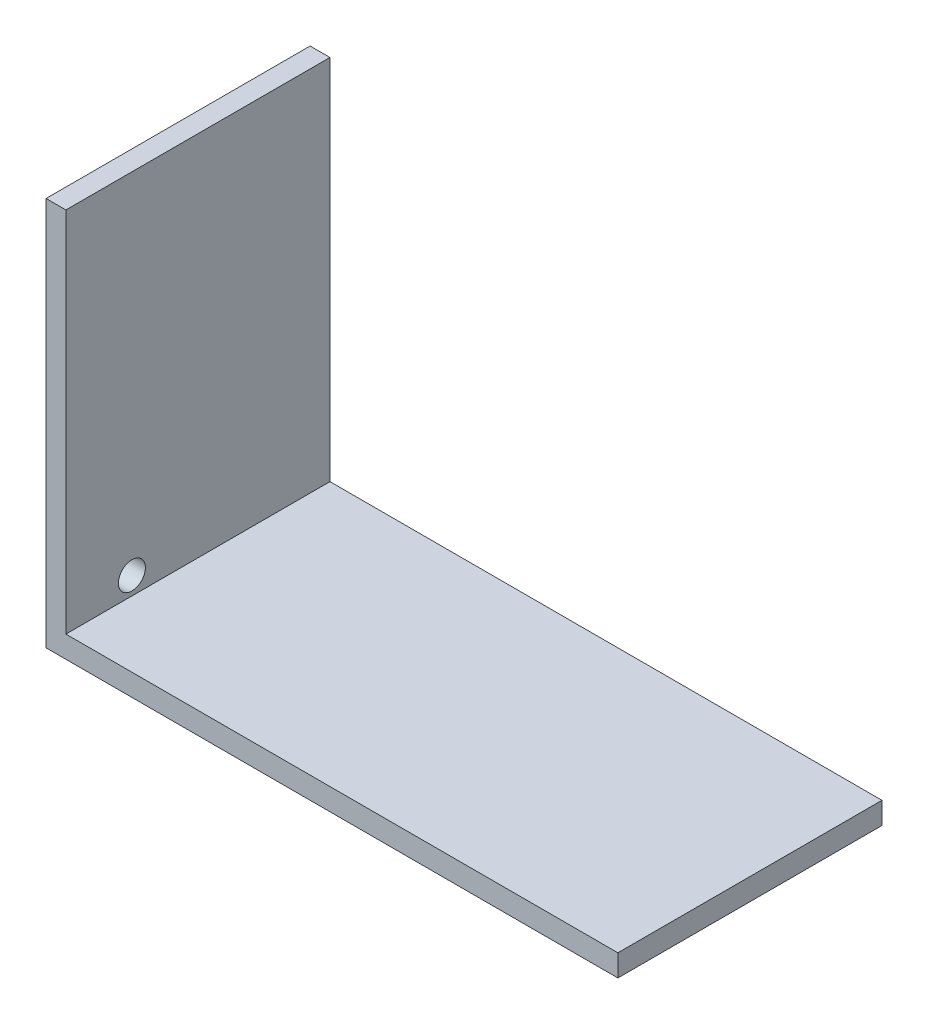
ISO-10303-21;
HEADER;
FILE_DESCRIPTION(('STEP AP214'),'2;1');
FILE_NAME('part.step','',(''),(''),'','','');
FILE_SCHEMA(('AUTOMOTIVE_DESIGN { 1 0 10303 214 1 1 1 1 }'));
ENDSEC;
DATA;
#1=APPLICATION_CONTEXT('core data for automotive mechanical design processes');
#2=APPLICATION_PROTOCOL_DEFINITION('international standard','automotive_design',2000,#1);
#3=PRODUCT_CONTEXT('',#1,'mechanical');
#4=PRODUCT('Part','Part','',(#3));
#5=PRODUCT_RELATED_PRODUCT_CATEGORY('part','',(#4));
#6=PRODUCT_DEFINITION_FORMATION('','',#4);
#7=PRODUCT_DEFINITION_CONTEXT('part definition',#1,'design');
#8=PRODUCT_DEFINITION('design','',#6,#7);
#9=PRODUCT_DEFINITION_SHAPE('','',#8);
#10=(LENGTH_UNIT() NAMED_UNIT(*) SI_UNIT(.MILLI.,.METRE.));
#11=(NAMED_UNIT(*) PLANE_ANGLE_UNIT() SI_UNIT($,.RADIAN.));
#12=(NAMED_UNIT(*) SI_UNIT($,.STERADIAN.) SOLID_ANGLE_UNIT());
#13=UNCERTAINTY_MEASURE_WITH_UNIT(LENGTH_MEASURE(1.E-05),#10,'distance_accuracy_value','');
#14=(GEOMETRIC_REPRESENTATION_CONTEXT(3) GLOBAL_UNCERTAINTY_ASSIGNED_CONTEXT((#13)) GLOBAL_UNIT_ASSIGNED_CONTEXT((#10,
#11,#12)) REPRESENTATION_CONTEXT('',''));
#15=CARTESIAN_POINT('',(0.,0.,0.));
#16=DIRECTION('',(0.,0.,1.));
#17=DIRECTION('',(1.,0.,0.));
#18=AXIS2_PLACEMENT_3D('',#15,#16,#17);
#19=CARTESIAN_POINT('',(-3.67500000001195,2.75,2.5));
#20=DIRECTION('',(0.,0.,-1.));
#21=DIRECTION('',(-1.,0.,0.));
#22=AXIS2_PLACEMENT_3D('',#19,#20,#21);
#23=PLANE('',#22);
#24=DIRECTION('',(1.,0.,0.));
#25=VECTOR('',#24,1.);
#26=CARTESIAN_POINT('',(-3.67500000001195,0.,2.5));
#27=LINE('',#26,#25);
#28=CARTESIAN_POINT('',(-6.17500000001195,0.,2.5));
#29=VERTEX_POINT('',#28);
#30=CARTESIAN_POINT('',(65.8249999999881,0.,2.5));
#31=VERTEX_POINT('',#30);
#32=EDGE_CURVE('E67',#29,#31,#27,.T.);
#33=ORIENTED_EDGE('',*,*,#32,.T.);
#34=DIRECTION('',(0.,-1.,0.));
#35=VECTOR('',#34,1.);
#36=CARTESIAN_POINT('',(65.8249999999881,2.75,2.5));
#37=LINE('',#36,#35);
#38=CARTESIAN_POINT('',(65.8249999999881,2.75,2.5));
#39=VERTEX_POINT('',#38);
#40=EDGE_CURVE('E11',#39,#31,#37,.T.);
#41=ORIENTED_EDGE('',*,*,#40,.F.);
#42=DIRECTION('',(1.,0.,0.));
#43=VECTOR('',#42,1.);
#44=CARTESIAN_POINT('',(-3.67500000001195,2.75,2.5));
#45=LINE('',#44,#43);
#46=CARTESIAN_POINT('',(-3.67500000001195,2.75,2.5));
#47=VERTEX_POINT('',#46);
#48=EDGE_CURVE('E96',#47,#39,#45,.T.);
#49=ORIENTED_EDGE('',*,*,#48,.F.);
#50=DIRECTION('',(0.,1.,0.));
#51=VECTOR('',#50,1.);
#52=CARTESIAN_POINT('',(-3.67500000001195,0.,2.5));
#53=LINE('',#52,#51);
#54=CARTESIAN_POINT('',(-3.67500000001195,49.,2.5));
#55=VERTEX_POINT('',#54);
#56=EDGE_CURVE('E86',#47,#55,#53,.T.);
#57=ORIENTED_EDGE('',*,*,#56,.T.);
#58=DIRECTION('',(1.,0.,0.));
#59=VECTOR('',#58,1.);
#60=CARTESIAN_POINT('',(-6.17500000001195,49.,2.5));
#61=LINE('',#60,#59);
#62=CARTESIAN_POINT('',(-6.17500000001195,49.,2.5));
#63=VERTEX_POINT('',#62);
#64=EDGE_CURVE('E107',#63,#55,#61,.T.);
#65=ORIENTED_EDGE('',*,*,#64,.F.);
#66=DIRECTION('',(0.,1.,0.));
#67=VECTOR('',#66,1.);
#68=CARTESIAN_POINT('',(-6.17500000001195,0.,2.5));
#69=LINE('',#68,#67);
#70=EDGE_CURVE('E131',#29,#63,#69,.T.);
#71=ORIENTED_EDGE('',*,*,#70,.F.);
#72=EDGE_LOOP('',(#33,#41,#49,#57,#65,#71));
#73=FACE_BOUND('',#72,.T.);
#74=ADVANCED_FACE('F39',(#73),#23,.F.);
#75=CARTESIAN_POINT('',(65.8249999999881,2.75,2.5));
#76=DIRECTION('',(-1.,0.,0.));
#77=DIRECTION('',(0.,0.,1.));
#78=AXIS2_PLACEMENT_3D('',#75,#76,#77);
#79=PLANE('',#78);
#80=DIRECTION('',(0.,0.,-1.));
#81=VECTOR('',#80,1.);
#82=CARTESIAN_POINT('',(65.8249999999881,0.,2.5));
#83=LINE('',#82,#81);
#84=CARTESIAN_POINT('',(65.8249999999881,0.,-30.75));
#85=VERTEX_POINT('',#84);
#86=EDGE_CURVE('E104',#31,#85,#83,.T.);
#87=ORIENTED_EDGE('',*,*,#86,.T.);
#88=DIRECTION('',(0.,-1.,0.));
#89=VECTOR('',#88,1.);
#90=CARTESIAN_POINT('',(65.8249999999881,2.75,-30.75));
#91=LINE('',#90,#89);
#92=CARTESIAN_POINT('',(65.8249999999881,2.75,-30.75));
#93=VERTEX_POINT('',#92);
#94=EDGE_CURVE('E47',#93,#85,#91,.T.);
#95=ORIENTED_EDGE('',*,*,#94,.F.);
#96=DIRECTION('',(0.,0.,-1.));
#97=VECTOR('',#96,1.);
#98=CARTESIAN_POINT('',(65.8249999999881,2.75,2.5));
#99=LINE('',#98,#97);
#100=EDGE_CURVE('E55',#39,#93,#99,.T.);
#101=ORIENTED_EDGE('',*,*,#100,.F.);
#102=ORIENTED_EDGE('',*,*,#40,.T.);
#103=EDGE_LOOP('',(#87,#95,#101,#102));
#104=FACE_BOUND('',#103,.T.);
#105=ADVANCED_FACE('F166',(#104),#79,.F.);
#106=CARTESIAN_POINT('',(-3.67500000001195,2.75,-30.75));
#107=DIRECTION('',(0.,0.,1.));
#108=DIRECTION('',(1.,0.,0.));
#109=AXIS2_PLACEMENT_3D('',#106,#107,#108);
#110=PLANE('',#109);
#111=DIRECTION('',(-1.,0.,0.));
#112=VECTOR('',#111,1.);
#113=CARTESIAN_POINT('',(-3.67500000001195,0.,-30.75));
#114=LINE('',#113,#112);
#115=CARTESIAN_POINT('',(-6.17500000001195,0.,-30.75));
#116=VERTEX_POINT('',#115);
#117=EDGE_CURVE('E101',#85,#116,#114,.T.);
#118=ORIENTED_EDGE('',*,*,#117,.T.);
#119=DIRECTION('',(0.,-1.,0.));
#120=VECTOR('',#119,1.);
#121=CARTESIAN_POINT('',(-6.17500000001195,0.,-30.75));
#122=LINE('',#121,#120);
#123=CARTESIAN_POINT('',(-6.17500000001195,49.,-30.75));
#124=VERTEX_POINT('',#123);
#125=EDGE_CURVE('E132',#124,#116,#122,.T.);
#126=ORIENTED_EDGE('',*,*,#125,.F.);
#127=DIRECTION('',(1.,0.,0.));
#128=VECTOR('',#127,1.);
#129=CARTESIAN_POINT('',(-6.17500000001195,49.,-30.75));
#130=LINE('',#129,#128);
#131=CARTESIAN_POINT('',(-3.67500000001195,49.,-30.75));
#132=VERTEX_POINT('',#131);
#133=EDGE_CURVE('E147',#124,#132,#130,.T.);
#134=ORIENTED_EDGE('',*,*,#133,.T.);
#135=DIRECTION('',(0.,-1.,0.));
#136=VECTOR('',#135,1.);
#137=CARTESIAN_POINT('',(-3.67500000001195,0.,-30.75));
#138=LINE('',#137,#136);
#139=CARTESIAN_POINT('',(-3.67500000001195,2.75,-30.75));
#140=VERTEX_POINT('',#139);
#141=EDGE_CURVE('E94',#132,#140,#138,.T.);
#142=ORIENTED_EDGE('',*,*,#141,.T.);
#143=DIRECTION('',(-1.,0.,0.));
#144=VECTOR('',#143,1.);
#145=CARTESIAN_POINT('',(-3.67500000001195,2.75,-30.75));
#146=LINE('',#145,#144);
#147=EDGE_CURVE('E100',#93,#140,#146,.T.);
#148=ORIENTED_EDGE('',*,*,#147,.F.);
#149=ORIENTED_EDGE('',*,*,#94,.T.);
#150=EDGE_LOOP('',(#118,#126,#134,#142,#148,#149));
#151=FACE_BOUND('',#150,.T.);
#152=ADVANCED_FACE('F116',(#151),#110,.F.);
#153=CARTESIAN_POINT('',(0.,2.75,0.));
#154=DIRECTION('',(0.,-1.,0.));
#155=DIRECTION('',(0.,0.,-1.));
#156=AXIS2_PLACEMENT_3D('',#153,#154,#155);
#157=PLANE('',#156);
#158=DIRECTION('',(0.,0.,1.));
#159=VECTOR('',#158,1.);
#160=CARTESIAN_POINT('',(-3.67500000001195,2.75,2.5));
#161=LINE('',#160,#159);
#162=EDGE_CURVE('E76',#140,#47,#161,.T.);
#163=ORIENTED_EDGE('',*,*,#162,.T.);
#164=ORIENTED_EDGE('',*,*,#48,.T.);
#165=ORIENTED_EDGE('',*,*,#100,.T.);
#166=ORIENTED_EDGE('',*,*,#147,.T.);
#167=EDGE_LOOP('',(#163,#164,#165,#166));
#168=FACE_BOUND('',#167,.T.);
#169=ADVANCED_FACE('F98',(#168),#157,.F.);
#170=CARTESIAN_POINT('',(0.,0.,0.));
#171=DIRECTION('',(0.,-1.,0.));
#172=DIRECTION('',(0.,0.,-1.));
#173=AXIS2_PLACEMENT_3D('',#170,#171,#172);
#174=PLANE('',#173);
#175=ORIENTED_EDGE('',*,*,#32,.F.);
#176=DIRECTION('',(0.,0.,1.));
#177=VECTOR('',#176,1.);
#178=CARTESIAN_POINT('',(-6.17500000001195,0.,-30.75));
#179=LINE('',#178,#177);
#180=EDGE_CURVE('E125',#116,#29,#179,.T.);
#181=ORIENTED_EDGE('',*,*,#180,.F.);
#182=ORIENTED_EDGE('',*,*,#117,.F.);
#183=ORIENTED_EDGE('',*,*,#86,.F.);
#184=EDGE_LOOP('',(#175,#181,#182,#183));
#185=FACE_BOUND('',#184,.T.);
#186=ADVANCED_FACE('F123',(#185),#174,.T.);
#187=CARTESIAN_POINT('',(-3.67500000001195,0.,0.));
#188=DIRECTION('',(1.,0.,0.));
#189=DIRECTION('',(0.,0.,-1.));
#190=AXIS2_PLACEMENT_3D('',#187,#188,#189);
#191=PLANE('',#190);
#192=CARTESIAN_POINT('',(-3.67500000001195,5.00000000000001,-5.8125));
#193=DIRECTION('',(1.,0.,0.));
#194=DIRECTION('',(0.,0.,-1.));
#195=AXIS2_PLACEMENT_3D('',#192,#193,#194);
#196=CIRCLE('',#195,1.69999999999999);
#197=CARTESIAN_POINT('',(-3.67500000001195,5.00000000000001,-7.51249999999999));
#198=VERTEX_POINT('',#197);
#199=EDGE_CURVE('E142',#198,#198,#196,.T.);
#200=ORIENTED_EDGE('',*,*,#199,.F.);
#201=EDGE_LOOP('',(#200));
#202=FACE_BOUND('',#201,.T.);
#203=ORIENTED_EDGE('',*,*,#162,.F.);
#204=ORIENTED_EDGE('',*,*,#141,.F.);
#205=DIRECTION('',(0.,0.,-1.));
#206=VECTOR('',#205,1.);
#207=CARTESIAN_POINT('',(-3.67500000001195,49.,-30.75));
#208=LINE('',#207,#206);
#209=EDGE_CURVE('E91',#55,#132,#208,.T.);
#210=ORIENTED_EDGE('',*,*,#209,.F.);
#211=ORIENTED_EDGE('',*,*,#56,.F.);
#212=EDGE_LOOP('',(#203,#204,#210,#211));
#213=FACE_BOUND('',#212,.T.);
#214=ADVANCED_FACE('F88',(#202,#213),#191,.T.);
#215=CARTESIAN_POINT('',(-6.17500000001195,49.,-30.75));
#216=DIRECTION('',(0.,-1.,0.));
#217=DIRECTION('',(0.,0.,-1.));
#218=AXIS2_PLACEMENT_3D('',#215,#216,#217);
#219=PLANE('',#218);
#220=ORIENTED_EDGE('',*,*,#209,.T.);
#221=ORIENTED_EDGE('',*,*,#133,.F.);
#222=DIRECTION('',(0.,0.,-1.));
#223=VECTOR('',#222,1.);
#224=CARTESIAN_POINT('',(-6.17500000001195,49.,-30.75));
#225=LINE('',#224,#223);
#226=EDGE_CURVE('E136',#63,#124,#225,.T.);
#227=ORIENTED_EDGE('',*,*,#226,.F.);
#228=ORIENTED_EDGE('',*,*,#64,.T.);
#229=EDGE_LOOP('',(#220,#221,#227,#228));
#230=FACE_BOUND('',#229,.T.);
#231=ADVANCED_FACE('F149',(#230),#219,.F.);
#232=CARTESIAN_POINT('',(-6.17500000001195,0.,0.));
#233=DIRECTION('',(1.,0.,0.));
#234=DIRECTION('',(0.,0.,-1.));
#235=AXIS2_PLACEMENT_3D('',#232,#233,#234);
#236=PLANE('',#235);
#237=CARTESIAN_POINT('',(-6.17500000001195,5.00000000000001,-5.8125));
#238=DIRECTION('',(-1.,0.,0.));
#239=DIRECTION('',(0.,0.,1.));
#240=AXIS2_PLACEMENT_3D('',#237,#238,#239);
#241=CIRCLE('',#240,1.69999999999999);
#242=CARTESIAN_POINT('',(-6.17500000001195,5.00000000000001,-4.11250000000001));
#243=VERTEX_POINT('',#242);
#244=EDGE_CURVE('E222',#243,#243,#241,.T.);
#245=ORIENTED_EDGE('',*,*,#244,.F.);
#246=EDGE_LOOP('',(#245));
#247=FACE_BOUND('',#246,.T.);
#248=ORIENTED_EDGE('',*,*,#125,.T.);
#249=ORIENTED_EDGE('',*,*,#180,.T.);
#250=ORIENTED_EDGE('',*,*,#70,.T.);
#251=ORIENTED_EDGE('',*,*,#226,.T.);
#252=EDGE_LOOP('',(#248,#249,#250,#251));
#253=FACE_BOUND('',#252,.T.);
#254=ADVANCED_FACE('F134',(#247,#253),#236,.F.);
#255=CARTESIAN_POINT('',(-6.17500000001195,5.00000000000001,-5.8125));
#256=DIRECTION('',(-1.,0.,0.));
#257=DIRECTION('',(0.,0.,1.));
#258=AXIS2_PLACEMENT_3D('',#255,#256,#257);
#259=CYLINDRICAL_SURFACE('',#258,1.69999999999999);
#260=ORIENTED_EDGE('',*,*,#244,.T.);
#261=EDGE_LOOP('',(#260));
#262=FACE_BOUND('',#261,.T.);
#263=ORIENTED_EDGE('',*,*,#199,.T.);
#264=EDGE_LOOP('',(#263));
#265=FACE_BOUND('',#264,.T.);
#266=ADVANCED_FACE('F159',(#262,#265),#259,.F.);
#267=CLOSED_SHELL('',(#74,#105,#152,#169,#186,#214,#231,#254,#266));
#268=MANIFOLD_SOLID_BREP('B2',#267);
#269=ADVANCED_BREP_SHAPE_REPRESENTATION('',(#18,#268),#14);
#270=SHAPE_DEFINITION_REPRESENTATION(#9,#269);
ENDSEC;
END-ISO-10303-21;
